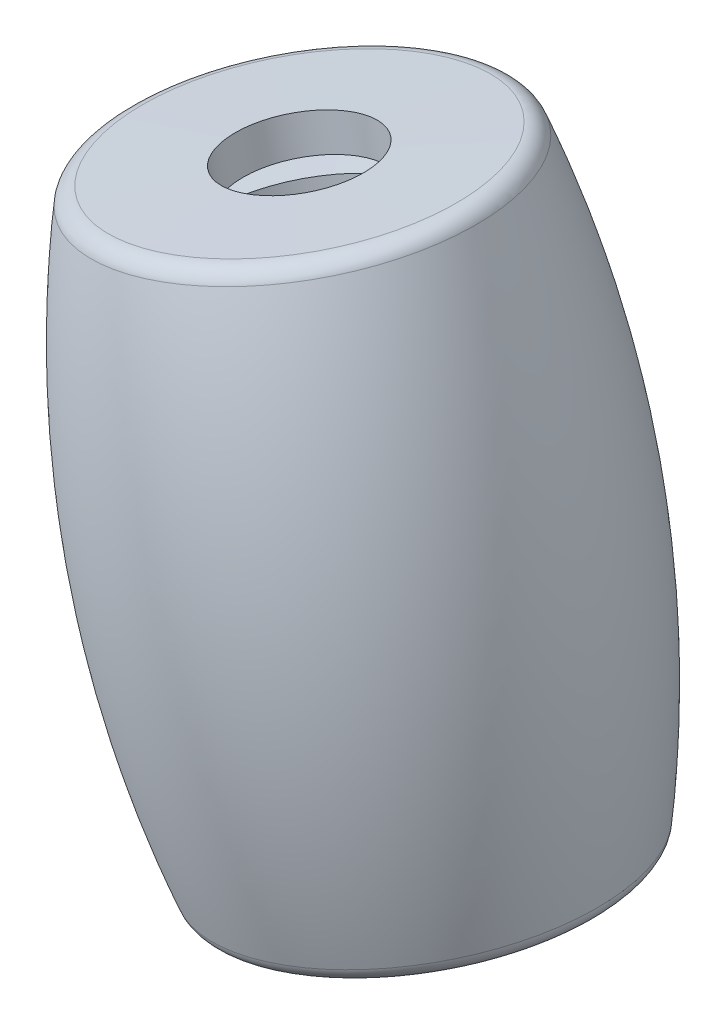
ISO-10303-21;
HEADER;
FILE_DESCRIPTION(('STEP AP214'),'2;1');
FILE_NAME('part.step','',(''),(''),'','','');
FILE_SCHEMA(('AUTOMOTIVE_DESIGN { 1 0 10303 214 1 1 1 1 }'));
ENDSEC;
DATA;
#1=APPLICATION_CONTEXT('core data for automotive mechanical design processes');
#2=APPLICATION_PROTOCOL_DEFINITION('international standard','automotive_design',2000,#1);
#3=PRODUCT_CONTEXT('',#1,'mechanical');
#4=PRODUCT('Part','Part','',(#3));
#5=PRODUCT_RELATED_PRODUCT_CATEGORY('part','',(#4));
#6=PRODUCT_DEFINITION_FORMATION('','',#4);
#7=PRODUCT_DEFINITION_CONTEXT('part definition',#1,'design');
#8=PRODUCT_DEFINITION('design','',#6,#7);
#9=PRODUCT_DEFINITION_SHAPE('','',#8);
#10=(LENGTH_UNIT() NAMED_UNIT(*) SI_UNIT(.MILLI.,.METRE.));
#11=(NAMED_UNIT(*) PLANE_ANGLE_UNIT() SI_UNIT($,.RADIAN.));
#12=(NAMED_UNIT(*) SI_UNIT($,.STERADIAN.) SOLID_ANGLE_UNIT());
#13=UNCERTAINTY_MEASURE_WITH_UNIT(LENGTH_MEASURE(1.E-05),#10,'distance_accuracy_value','');
#14=(GEOMETRIC_REPRESENTATION_CONTEXT(3) GLOBAL_UNCERTAINTY_ASSIGNED_CONTEXT((#13)) GLOBAL_UNIT_ASSIGNED_CONTEXT((#10,
#11,#12)) REPRESENTATION_CONTEXT('',''));
#15=CARTESIAN_POINT('',(0.,0.,0.));
#16=DIRECTION('',(0.,0.,1.));
#17=DIRECTION('',(1.,0.,0.));
#18=AXIS2_PLACEMENT_3D('',#15,#16,#17);
#19=CARTESIAN_POINT('',(-23.5095303593415,-4.85303845886221,0.));
#20=DIRECTION('',(0.222520933956314,-0.974927912181824,0.));
#21=DIRECTION('',(0.974927912181824,0.222520933956314,0.));
#22=AXIS2_PLACEMENT_3D('',#19,#20,#21);
#23=CONICAL_SURFACE('',#22,4.5000000000979,1.48352986419963);
#24=CARTESIAN_POINT('',(-23.5095303593419,-4.85303845886064,0.));
#25=DIRECTION('',(-0.222520933956314,0.974927912181824,0.));
#26=DIRECTION('',(-0.974927912181824,-0.222520933956314,0.));
#27=AXIS2_PLACEMENT_3D('',#24,#25,#26);
#28=CIRCLE('',#27,4.5);
#29=CARTESIAN_POINT('',(-27.8967059641601,-5.85438266166405,0.));
#30=VERTEX_POINT('',#29);
#31=EDGE_CURVE('E19',#30,#30,#28,.F.);
#32=ORIENTED_EDGE('',*,*,#31,.T.);
#33=EDGE_LOOP('',(#32));
#34=FACE_BOUND('',#33,.T.);
#35=CARTESIAN_POINT('',(-23.5387324480194,-4.72509574875428,0.));
#36=DIRECTION('',(-0.222520933956314,0.974927912181824,0.));
#37=DIRECTION('',(-0.974927912181824,-0.222520933956314,0.));
#38=AXIS2_PLACEMENT_3D('',#35,#36,#37);
#39=CIRCLE('',#38,3.);
#40=CARTESIAN_POINT('',(-26.4635161845649,-5.39265855062322,0.));
#41=VERTEX_POINT('',#40);
#42=EDGE_CURVE('E91',#41,#41,#39,.T.);
#43=ORIENTED_EDGE('',*,*,#42,.T.);
#44=EDGE_LOOP('',(#43));
#45=FACE_BOUND('',#44,.T.);
#46=ADVANCED_FACE('F15',(#34,#45),#23,.F.);
#47=CARTESIAN_POINT('',(-23.3982698923637,-5.34050241495155,0.));
#48=DIRECTION('',(-0.222520933956314,0.974927912181824,0.));
#49=DIRECTION('',(-0.974927912181824,-0.222520933956314,0.));
#50=AXIS2_PLACEMENT_3D('',#47,#48,#49);
#51=CYLINDRICAL_SURFACE('',#50,4.5);
#52=CARTESIAN_POINT('',(-23.2870094253839,-5.82796637104959,0.));
#53=DIRECTION('',(-0.222520933956314,0.974927912181824,0.));
#54=DIRECTION('',(0.0263565158210007,0.00601570274380409,0.999634505904171));
#55=AXIS2_PLACEMENT_3D('',#52,#53,#54);
#56=CIRCLE('',#55,4.49999999998419);
#57=CARTESIAN_POINT('',(-23.1684051041898,-5.80089570870257,4.49835527655296));
#58=VERTEX_POINT('',#57);
#59=EDGE_CURVE('E89',#58,#58,#56,.F.);
#60=ORIENTED_EDGE('',*,*,#59,.T.);
#61=EDGE_LOOP('',(#60));
#62=FACE_BOUND('',#61,.T.);
#63=ORIENTED_EDGE('',*,*,#31,.F.);
#64=EDGE_LOOP('',(#63));
#65=FACE_BOUND('',#64,.T.);
#66=ADVANCED_FACE('F99',(#62,#65),#51,.F.);
#67=CARTESIAN_POINT('',(-23.8544378069741,-3.34190019497881,0.));
#68=DIRECTION('',(-0.222520933956314,0.974927912181824,0.));
#69=DIRECTION('',(-0.974927912181824,-0.222520933956314,0.));
#70=AXIS2_PLACEMENT_3D('',#67,#68,#69);
#71=CYLINDRICAL_SURFACE('',#70,3.);
#72=ORIENTED_EDGE('',*,*,#42,.F.);
#73=EDGE_LOOP('',(#72));
#74=FACE_BOUND('',#73,.T.);
#75=CARTESIAN_POINT('',(-24.1701431659294,-1.95870464120101,0.));
#76=DIRECTION('',(-0.222520933956314,0.974927912181824,0.));
#77=DIRECTION('',(0.0263565158208105,0.00601570274376067,0.999634505904176));
#78=AXIS2_PLACEMENT_3D('',#75,#76,#77);
#79=CIRCLE('',#78,3.0000000000084);
#80=CARTESIAN_POINT('',(-24.0910736184667,-1.94065753296968,2.99890351772092));
#81=VERTEX_POINT('',#80);
#82=EDGE_CURVE('E86',#81,#81,#79,.T.);
#83=ORIENTED_EDGE('',*,*,#82,.T.);
#84=EDGE_LOOP('',(#83));
#85=FACE_BOUND('',#84,.T.);
#86=ADVANCED_FACE('F101',(#74,#85),#71,.F.);
#87=CARTESIAN_POINT('',(-23.2870094253839,-5.82796637104959,0.));
#88=DIRECTION('',(-0.222520933956314,0.974927912181824,0.));
#89=DIRECTION('',(-0.974927912181824,-0.222520933956314,0.));
#90=AXIS2_PLACEMENT_3D('',#87,#88,#89);
#91=CONICAL_SURFACE('',#90,4.49999999998419,1.48352986420208);
#92=ORIENTED_EDGE('',*,*,#59,.F.);
#93=EDGE_LOOP('',(#92));
#94=FACE_BOUND('',#93,.T.);
#95=CARTESIAN_POINT('',(-23.257807336708,-5.95590908114882,0.));
#96=DIRECTION('',(-0.222520933956314,0.974927912181824,0.));
#97=DIRECTION('',(-0.974927912181824,-0.222520933956314,0.));
#98=AXIS2_PLACEMENT_3D('',#95,#96,#97);
#99=CIRCLE('',#98,3.);
#100=CARTESIAN_POINT('',(-26.1825910732534,-6.62347188301776,0.));
#101=VERTEX_POINT('',#100);
#102=EDGE_CURVE('E83',#101,#101,#99,.F.);
#103=ORIENTED_EDGE('',*,*,#102,.T.);
#104=EDGE_LOOP('',(#103));
#105=FACE_BOUND('',#104,.T.);
#106=ADVANCED_FACE('F109',(#94,#105),#91,.F.);
#107=CARTESIAN_POINT('',(-24.1993452546054,-1.83076193110155,0.));
#108=DIRECTION('',(-0.222520933956314,0.974927912181824,0.));
#109=DIRECTION('',(-0.974927912181824,-0.222520933956314,0.));
#110=AXIS2_PLACEMENT_3D('',#107,#108,#109);
#111=CONICAL_SURFACE('',#110,4.49999999998414,1.48352986419936);
#112=CARTESIAN_POINT('',(-24.1993452546064,-1.83076193109698,0.));
#113=DIRECTION('',(-0.222520933956314,0.974927912181824,0.));
#114=DIRECTION('',(-0.974927912181824,-0.222520933956314,0.));
#115=AXIS2_PLACEMENT_3D('',#112,#113,#114);
#116=CIRCLE('',#115,4.5);
#117=CARTESIAN_POINT('',(-28.5865208594246,-2.8321061339004,0.));
#118=VERTEX_POINT('',#117);
#119=EDGE_CURVE('E80',#118,#118,#116,.T.);
#120=ORIENTED_EDGE('',*,*,#119,.T.);
#121=EDGE_LOOP('',(#120));
#122=FACE_BOUND('',#121,.T.);
#123=ORIENTED_EDGE('',*,*,#82,.F.);
#124=EDGE_LOOP('',(#123));
#125=FACE_BOUND('',#124,.T.);
#126=ADVANCED_FACE('F186',(#122,#125),#111,.F.);
#127=CARTESIAN_POINT('',(-22.9421019777533,-7.33910463492429,0.));
#128=DIRECTION('',(-0.222520933956314,0.974927912181824,0.));
#129=DIRECTION('',(-0.974927912181824,-0.222520933956314,0.));
#130=AXIS2_PLACEMENT_3D('',#127,#128,#129);
#131=CYLINDRICAL_SURFACE('',#130,3.);
#132=ORIENTED_EDGE('',*,*,#102,.F.);
#133=EDGE_LOOP('',(#132));
#134=FACE_BOUND('',#133,.T.);
#135=CARTESIAN_POINT('',(-22.6263966187975,-8.72230018870423,0.));
#136=DIRECTION('',(0.222520933956314,-0.974927912181824,0.));
#137=DIRECTION('',(-0.0263565158209064,-0.00601570274378249,-0.999634505904173));
#138=AXIS2_PLACEMENT_3D('',#135,#136,#137);
#139=CIRCLE('',#138,3.0000000000084);
#140=CARTESIAN_POINT('',(-22.7054661662605,-8.74034729693562,-2.99890351772092));
#141=VERTEX_POINT('',#140);
#142=EDGE_CURVE('E77',#141,#141,#139,.T.);
#143=ORIENTED_EDGE('',*,*,#142,.T.);
#144=EDGE_LOOP('',(#143));
#145=FACE_BOUND('',#144,.T.);
#146=ADVANCED_FACE('F182',(#134,#145),#131,.F.);
#147=CARTESIAN_POINT('',(-24.3106057215846,-1.34329797500607,0.));
#148=DIRECTION('',(-0.222520933956314,0.974927912181824,0.));
#149=DIRECTION('',(-0.974927912181824,-0.222520933956314,0.));
#150=AXIS2_PLACEMENT_3D('',#147,#148,#149);
#151=CYLINDRICAL_SURFACE('',#150,4.5);
#152=CARTESIAN_POINT('',(-24.4218661885643,-0.855834018908472,0.));
#153=DIRECTION('',(0.222520933956314,-0.974927912181824,0.));
#154=DIRECTION('',(-0.0263565158205878,-0.00601570274370977,-0.999634505904182));
#155=AXIS2_PLACEMENT_3D('',#152,#153,#154);
#156=CIRCLE('',#155,4.49999999998413);
#157=CARTESIAN_POINT('',(-24.5404705097565,-0.88290468125507,-4.49835527655296));
#158=VERTEX_POINT('',#157);
#159=EDGE_CURVE('E74',#158,#158,#156,.F.);
#160=ORIENTED_EDGE('',*,*,#159,.T.);
#161=EDGE_LOOP('',(#160));
#162=FACE_BOUND('',#161,.T.);
#163=ORIENTED_EDGE('',*,*,#119,.F.);
#164=EDGE_LOOP('',(#163));
#165=FACE_BOUND('',#164,.T.);
#166=ADVANCED_FACE('F178',(#162,#165),#151,.F.);
#167=CARTESIAN_POINT('',(-22.59719453012,-8.85024289881044,0.));
#168=DIRECTION('',(0.222520933956314,-0.974927912181824,0.));
#169=DIRECTION('',(0.974927912181824,0.222520933956314,0.));
#170=AXIS2_PLACEMENT_3D('',#167,#168,#169);
#171=CONICAL_SURFACE('',#170,4.49999999998419,1.48352986419684);
#172=ORIENTED_EDGE('',*,*,#142,.F.);
#173=EDGE_LOOP('',(#172));
#174=FACE_BOUND('',#173,.T.);
#175=CARTESIAN_POINT('',(-22.597194530121,-8.85024289880612,0.));
#176=DIRECTION('',(-0.222520933956314,0.974927912181824,0.));
#177=DIRECTION('',(-0.974927912181824,-0.222520933956314,0.));
#178=AXIS2_PLACEMENT_3D('',#175,#176,#177);
#179=CIRCLE('',#178,4.5);
#180=CARTESIAN_POINT('',(-26.9843701349392,-9.85158710160953,0.));
#181=VERTEX_POINT('',#180);
#182=EDGE_CURVE('E71',#181,#181,#179,.F.);
#183=ORIENTED_EDGE('',*,*,#182,.T.);
#184=EDGE_LOOP('',(#183));
#185=FACE_BOUND('',#184,.T.);
#186=ADVANCED_FACE('F174',(#174,#185),#171,.F.);
#187=CARTESIAN_POINT('',(-24.4218661885642,-0.855834018908567,0.));
#188=DIRECTION('',(0.222520933956314,-0.974927912181824,0.));
#189=DIRECTION('',(0.974927912181824,0.222520933956314,0.));
#190=AXIS2_PLACEMENT_3D('',#187,#188,#189);
#191=CONICAL_SURFACE('',#190,4.49999999992729,1.48352986419471);
#192=ORIENTED_EDGE('',*,*,#159,.F.);
#193=EDGE_LOOP('',(#192));
#194=FACE_BOUND('',#193,.T.);
#195=CARTESIAN_POINT('',(-24.4510682772403,-0.727891308808807,0.));
#196=DIRECTION('',(-0.222520933956314,0.974927912181824,0.));
#197=DIRECTION('',(-0.974927912181824,-0.222520933956314,0.));
#198=AXIS2_PLACEMENT_3D('',#195,#196,#197);
#199=CIRCLE('',#198,3.);
#200=CARTESIAN_POINT('',(-27.3758520137858,-1.39545411067775,0.));
#201=VERTEX_POINT('',#200);
#202=EDGE_CURVE('E68',#201,#201,#199,.T.);
#203=ORIENTED_EDGE('',*,*,#202,.T.);
#204=EDGE_LOOP('',(#203));
#205=FACE_BOUND('',#204,.T.);
#206=ADVANCED_FACE('F170',(#194,#205),#191,.F.);
#207=CARTESIAN_POINT('',(-22.4859340631428,-9.33770685489703,0.));
#208=DIRECTION('',(-0.222520933956314,0.974927912181824,0.));
#209=DIRECTION('',(-0.974927912181824,-0.222520933956314,0.));
#210=AXIS2_PLACEMENT_3D('',#207,#208,#209);
#211=CYLINDRICAL_SURFACE('',#210,4.5);
#212=CARTESIAN_POINT('',(-22.3746735961657,-9.82517081098326,0.));
#213=DIRECTION('',(-0.222520933956314,0.974927912181824,0.));
#214=DIRECTION('',(0.026356515821208,0.00601570274385147,0.999634505904165));
#215=AXIS2_PLACEMENT_3D('',#212,#213,#214);
#216=CIRCLE('',#215,4.49999999998421);
#217=CARTESIAN_POINT('',(-22.2560692749707,-9.79810014863602,4.49835527655296));
#218=VERTEX_POINT('',#217);
#219=EDGE_CURVE('E65',#218,#218,#216,.F.);
#220=ORIENTED_EDGE('',*,*,#219,.T.);
#221=EDGE_LOOP('',(#220));
#222=FACE_BOUND('',#221,.T.);
#223=ORIENTED_EDGE('',*,*,#182,.F.);
#224=EDGE_LOOP('',(#223));
#225=FACE_BOUND('',#224,.T.);
#226=ADVANCED_FACE('F166',(#222,#225),#211,.F.);
#227=CARTESIAN_POINT('',(-24.6117730782902,-0.0237975708421165,0.));
#228=DIRECTION('',(-0.222520933956314,0.974927912181824,0.));
#229=DIRECTION('',(-0.974927912181824,-0.222520933956314,0.));
#230=AXIS2_PLACEMENT_3D('',#227,#228,#229);
#231=CYLINDRICAL_SURFACE('',#230,3.);
#232=ORIENTED_EDGE('',*,*,#202,.F.);
#233=EDGE_LOOP('',(#232));
#234=FACE_BOUND('',#233,.T.);
#235=CARTESIAN_POINT('',(-24.7724778793394,0.68029616712169,0.));
#236=DIRECTION('',(-0.222520933956314,0.974927912181824,0.));
#237=DIRECTION('',(0.0263565158206279,0.00601570274371903,0.999634505904181));
#238=AXIS2_PLACEMENT_3D('',#235,#236,#237);
#239=CIRCLE('',#238,3.00000000000838);
#240=CARTESIAN_POINT('',(-24.6934083318773,0.698343275352897,2.99890351772092));
#241=VERTEX_POINT('',#240);
#242=EDGE_CURVE('E62',#241,#241,#239,.T.);
#243=ORIENTED_EDGE('',*,*,#242,.T.);
#244=EDGE_LOOP('',(#243));
#245=FACE_BOUND('',#244,.T.);
#246=ADVANCED_FACE('F162',(#234,#245),#231,.F.);
#247=CARTESIAN_POINT('',(-22.3746735961657,-9.82517081098326,0.));
#248=DIRECTION('',(-0.222520933956314,0.974927912181824,0.));
#249=DIRECTION('',(-0.974927912181824,-0.222520933956314,0.));
#250=AXIS2_PLACEMENT_3D('',#247,#248,#249);
#251=CONICAL_SURFACE('',#250,4.49999999998421,1.48352986419478);
#252=ORIENTED_EDGE('',*,*,#219,.F.);
#253=EDGE_LOOP('',(#252));
#254=FACE_BOUND('',#253,.T.);
#255=CARTESIAN_POINT('',(-22.3454715074871,-9.9531135210943,0.));
#256=DIRECTION('',(-0.222520933956314,0.974927912181824,0.));
#257=DIRECTION('',(-0.974927912181824,-0.222520933956314,0.));
#258=AXIS2_PLACEMENT_3D('',#255,#256,#257);
#259=CIRCLE('',#258,3.);
#260=CARTESIAN_POINT('',(-25.2702552440326,-10.6206763229632,0.));
#261=VERTEX_POINT('',#260);
#262=EDGE_CURVE('E59',#261,#261,#259,.F.);
#263=ORIENTED_EDGE('',*,*,#262,.T.);
#264=EDGE_LOOP('',(#263));
#265=FACE_BOUND('',#264,.T.);
#266=ADVANCED_FACE('F158',(#254,#265),#251,.F.);
#267=CARTESIAN_POINT('',(-24.7890257295888,0.752797036176678,0.));
#268=DIRECTION('',(-0.222520933956314,0.974927912181824,0.));
#269=DIRECTION('',(-0.974927912181824,-0.222520933956314,0.));
#270=AXIS2_PLACEMENT_3D('',#267,#268,#269);
#271=CONICAL_SURFACE('',#270,3.84999999997193,1.48352986419926);
#272=CARTESIAN_POINT('',(-24.7890257295907,0.752797036184849,0.));
#273=DIRECTION('',(-0.222520933956314,0.974927912181824,0.));
#274=DIRECTION('',(-0.974927912181824,-0.222520933956314,0.));
#275=AXIS2_PLACEMENT_3D('',#272,#273,#274);
#276=CIRCLE('',#275,3.85);
#277=CARTESIAN_POINT('',(-28.5424981914907,-0.10390855954696,0.));
#278=VERTEX_POINT('',#277);
#279=EDGE_CURVE('E56',#278,#278,#276,.T.);
#280=ORIENTED_EDGE('',*,*,#279,.T.);
#281=EDGE_LOOP('',(#280));
#282=FACE_BOUND('',#281,.T.);
#283=ORIENTED_EDGE('',*,*,#242,.F.);
#284=EDGE_LOOP('',(#283));
#285=FACE_BOUND('',#284,.T.);
#286=ADVANCED_FACE('F154',(#282,#285),#271,.F.);
#287=CARTESIAN_POINT('',(-22.1847667064372,-10.657207259061,0.));
#288=DIRECTION('',(-0.222520933956314,0.974927912181824,0.));
#289=DIRECTION('',(-0.974927912181824,-0.222520933956314,0.));
#290=AXIS2_PLACEMENT_3D('',#287,#288,#289);
#291=CYLINDRICAL_SURFACE('',#290,3.);
#292=ORIENTED_EDGE('',*,*,#262,.F.);
#293=EDGE_LOOP('',(#292));
#294=FACE_BOUND('',#293,.T.);
#295=CARTESIAN_POINT('',(-22.0240619053874,-11.3613009970273,0.));
#296=DIRECTION('',(0.222520933956314,-0.974927912181824,0.));
#297=DIRECTION('',(-0.0263565158206591,-0.00601570274372598,-0.99963450590418));
#298=AXIS2_PLACEMENT_3D('',#295,#296,#297);
#299=CIRCLE('',#298,2.99999999995151);
#300=CARTESIAN_POINT('',(-22.1031314528481,-11.3793481052582,-2.99890351766408));
#301=VERTEX_POINT('',#300);
#302=EDGE_CURVE('E53',#301,#301,#299,.T.);
#303=ORIENTED_EDGE('',*,*,#302,.T.);
#304=EDGE_LOOP('',(#303));
#305=FACE_BOUND('',#304,.T.);
#306=ADVANCED_FACE('F150',(#294,#305),#291,.F.);
#307=CARTESIAN_POINT('',(-24.8922472369865,1.20504000905242,0.));
#308=DIRECTION('',(-0.222520933956314,0.974927912181824,0.));
#309=DIRECTION('',(-0.974927912181824,-0.222520933956314,0.));
#310=AXIS2_PLACEMENT_3D('',#307,#308,#309);
#311=CYLINDRICAL_SURFACE('',#310,3.85);
#312=CARTESIAN_POINT('',(-24.9954687443835,1.65728298192504,0.));
#313=DIRECTION('',(0.222520933956314,-0.974927912181824,0.));
#314=DIRECTION('',(-0.0263565158209235,-0.00601570274378623,-0.999634505904173));
#315=AXIS2_PLACEMENT_3D('',#312,#313,#314);
#316=CIRCLE('',#315,3.84999999997193);
#317=CARTESIAN_POINT('',(-25.0969413302933,1.63412252636164,-3.848592847703));
#318=VERTEX_POINT('',#317);
#319=EDGE_CURVE('E50',#318,#318,#316,.F.);
#320=ORIENTED_EDGE('',*,*,#319,.T.);
#321=EDGE_LOOP('',(#320));
#322=FACE_BOUND('',#321,.T.);
#323=ORIENTED_EDGE('',*,*,#279,.F.);
#324=EDGE_LOOP('',(#323));
#325=FACE_BOUND('',#324,.T.);
#326=ADVANCED_FACE('F146',(#322,#325),#311,.F.);
#327=CARTESIAN_POINT('',(-22.0075140551396,-11.4338018660756,0.));
#328=DIRECTION('',(0.222520933956314,-0.974927912181824,0.));
#329=DIRECTION('',(0.974927912181824,0.222520933956314,0.));
#330=AXIS2_PLACEMENT_3D('',#327,#328,#329);
#331=CONICAL_SURFACE('',#330,3.84999999985819,1.48352986419926);
#332=CARTESIAN_POINT('',(-22.0075140551367,-11.4338018660879,0.));
#333=DIRECTION('',(-0.222520933956314,0.974927912181824,0.));
#334=DIRECTION('',(-0.974927912181824,-0.222520933956314,0.));
#335=AXIS2_PLACEMENT_3D('',#332,#333,#334);
#336=CIRCLE('',#335,3.85000000000001);
#337=CARTESIAN_POINT('',(-25.7609865170368,-12.2905074618198,0.));
#338=VERTEX_POINT('',#337);
#339=EDGE_CURVE('E47',#338,#338,#336,.F.);
#340=ORIENTED_EDGE('',*,*,#339,.T.);
#341=EDGE_LOOP('',(#340));
#342=FACE_BOUND('',#341,.T.);
#343=ORIENTED_EDGE('',*,*,#302,.F.);
#344=EDGE_LOOP('',(#343));
#345=FACE_BOUND('',#344,.T.);
#346=ADVANCED_FACE('F142',(#342,#345),#331,.F.);
#347=CARTESIAN_POINT('',(-24.9954687443836,1.65728298192543,0.));
#348=DIRECTION('',(0.222520933956314,-0.974927912181824,0.));
#349=DIRECTION('',(0.974927912181824,0.222520933956314,0.));
#350=AXIS2_PLACEMENT_3D('',#347,#348,#349);
#351=CONICAL_SURFACE('',#350,3.85000000002879,1.56206968054022);
#352=ORIENTED_EDGE('',*,*,#319,.F.);
#353=EDGE_LOOP('',(#352));
#354=FACE_BOUND('',#353,.T.);
#355=CARTESIAN_POINT('',(-24.9993525659249,1.67429911591027,0.));
#356=DIRECTION('',(-0.222520933956314,0.974927912181824,0.));
#357=DIRECTION('',(-0.974927912181824,-0.222520933956314,0.));
#358=AXIS2_PLACEMENT_3D('',#355,#356,#357);
#359=CIRCLE('',#358,1.85);
#360=CARTESIAN_POINT('',(-26.8029692034613,1.26263538809108,0.));
#361=VERTEX_POINT('',#360);
#362=EDGE_CURVE('E44',#361,#361,#359,.T.);
#363=ORIENTED_EDGE('',*,*,#362,.T.);
#364=EDGE_LOOP('',(#363));
#365=FACE_BOUND('',#364,.T.);
#366=ADVANCED_FACE('F138',(#354,#365),#351,.F.);
#367=CARTESIAN_POINT('',(-21.8239342846228,-12.238117393638,0.));
#368=DIRECTION('',(-0.222520933956314,0.974927912181824,0.));
#369=DIRECTION('',(-0.974927912181824,-0.222520933956314,0.));
#370=AXIS2_PLACEMENT_3D('',#367,#368,#369);
#371=CYLINDRICAL_SURFACE('',#370,3.85000000000001);
#372=ORIENTED_EDGE('',*,*,#339,.F.);
#373=EDGE_LOOP('',(#372));
#374=FACE_BOUND('',#373,.T.);
#375=CARTESIAN_POINT('',(-21.6403545141094,-13.0424329211854,0.));
#376=DIRECTION('',(-0.222520933956314,0.974927912181824,0.));
#377=DIRECTION('',(0.0263565158205047,0.00601570274369066,0.999634505904184));
#378=AXIS2_PLACEMENT_3D('',#375,#376,#377);
#379=CIRCLE('',#378,3.84999999997189);
#380=CARTESIAN_POINT('',(-21.5388819282012,-13.0192724656224,3.848592847703));
#381=VERTEX_POINT('',#380);
#382=EDGE_CURVE('E41',#381,#381,#379,.T.);
#383=ORIENTED_EDGE('',*,*,#382,.F.);
#384=EDGE_LOOP('',(#383));
#385=FACE_BOUND('',#384,.T.);
#386=ADVANCED_FACE('F134',(#374,#385),#371,.F.);
#387=CARTESIAN_POINT('',(-25.1106130329031,2.16176307200118,0.));
#388=DIRECTION('',(-0.222520933956314,0.974927912181824,0.));
#389=DIRECTION('',(-0.974927912181824,-0.222520933956314,0.));
#390=AXIS2_PLACEMENT_3D('',#387,#388,#389);
#391=CYLINDRICAL_SURFACE('',#390,1.85);
#392=ORIENTED_EDGE('',*,*,#362,.F.);
#393=EDGE_LOOP('',(#392));
#394=FACE_BOUND('',#393,.T.);
#395=CARTESIAN_POINT('',(-25.2218734998796,2.64922702808501,0.));
#396=DIRECTION('',(0.222520933956314,-0.974927912181824,0.));
#397=DIRECTION('',(-0.0263565158209801,-0.00601570274379938,-0.999634505904171));
#398=AXIS2_PLACEMENT_3D('',#395,#396,#397);
#399=CIRCLE('',#398,1.85000000000424);
#400=CARTESIAN_POINT('',(-25.2706330541486,2.63809797800896,-1.84932383592695));
#401=VERTEX_POINT('',#400);
#402=EDGE_CURVE('E38',#401,#401,#399,.T.);
#403=ORIENTED_EDGE('',*,*,#402,.F.);
#404=EDGE_LOOP('',(#403));
#405=FACE_BOUND('',#404,.T.);
#406=ADVANCED_FACE('F130',(#394,#405),#391,.F.);
#407=CARTESIAN_POINT('',(-21.6416679369421,-13.0366784397652,0.));
#408=DIRECTION('',(-0.222520933956314,0.974927912181824,0.));
#409=DIRECTION('',(-0.974927912181824,-0.222520933956314,0.));
#410=AXIS2_PLACEMENT_3D('',#407,#408,#409);
#411=CONICAL_SURFACE('',#410,4.52635591340722,1.5620696805407);
#412=CARTESIAN_POINT('',(-21.6416679369423,-13.0366784397641,0.));
#413=DIRECTION('',(-0.222520933956314,0.974927912181824,0.));
#414=DIRECTION('',(0.0263565158207468,0.00601570274374602,0.999634505904178));
#415=AXIS2_PLACEMENT_3D('',#412,#413,#414);
#416=CIRCLE('',#415,4.52635591341317);
#417=CARTESIAN_POINT('',(-21.5223689657001,-13.0094492280766,4.52470155705122));
#418=VERTEX_POINT('',#417);
#419=EDGE_CURVE('E35',#418,#418,#416,.T.);
#420=ORIENTED_EDGE('',*,*,#419,.F.);
#421=EDGE_LOOP('',(#420));
#422=FACE_BOUND('',#421,.T.);
#423=ORIENTED_EDGE('',*,*,#382,.T.);
#424=EDGE_LOOP('',(#423));
#425=FACE_BOUND('',#424,.T.);
#426=ADVANCED_FACE('F126',(#422,#425),#411,.T.);
#427=CARTESIAN_POINT('',(-25.2166762555059,2.62645641268116,0.));
#428=DIRECTION('',(0.222520933956314,-0.974927912181824,0.));
#429=DIRECTION('',(0.974927912181824,0.222520933956314,0.));
#430=AXIS2_PLACEMENT_3D('',#427,#428,#429);
#431=CONICAL_SURFACE('',#430,4.5263559138053,1.56206968054048);
#432=CARTESIAN_POINT('',(-25.216676255504,2.62645641267324,0.));
#433=DIRECTION('',(0.222520933956314,-0.974927912181824,0.));
#434=DIRECTION('',(0.0263565158207467,0.00601570274374621,0.999634505904178));
#435=AXIS2_PLACEMENT_3D('',#432,#433,#434);
#436=CIRCLE('',#435,4.52635591396777);
#437=CARTESIAN_POINT('',(-25.0973772842472,2.65368562436406,4.52470155760562));
#438=VERTEX_POINT('',#437);
#439=EDGE_CURVE('E28',#438,#438,#436,.T.);
#440=ORIENTED_EDGE('',*,*,#439,.F.);
#441=EDGE_LOOP('',(#440));
#442=FACE_BOUND('',#441,.T.);
#443=ORIENTED_EDGE('',*,*,#402,.T.);
#444=EDGE_LOOP('',(#443));
#445=FACE_BOUND('',#444,.T.);
#446=ADVANCED_FACE('F123',(#442,#445),#431,.T.);
#447=CARTESIAN_POINT('',(-21.7529241674625,-12.5492330448082,0.));
#448=DIRECTION('',(-0.222520933956314,0.974927912181824,0.));
#449=DIRECTION('',(-0.974927912181824,-0.222520933956314,0.));
#450=AXIS2_PLACEMENT_3D('',#447,#448,#449);
#451=TOROIDAL_SURFACE('',#450,4.521992645522,0.500000000000003);
#452=CARTESIAN_POINT('',(-21.7245131856191,-12.6737096894059,0.));
#453=DIRECTION('',(-0.222520933956314,0.974927912181824,0.));
#454=DIRECTION('',(0.0263565158207465,0.00601570274374641,0.999634505904178));
#455=AXIS2_PLACEMENT_3D('',#452,#453,#454);
#456=CIRCLE('',#455,5.0054162496834);
#457=CARTESIAN_POINT('',(-21.5925878530449,-12.6435985931391,5.00358679959702));
#458=VERTEX_POINT('',#457);
#459=EDGE_CURVE('E23',#458,#458,#456,.T.);
#460=ORIENTED_EDGE('',*,*,#459,.F.);
#461=EDGE_LOOP('',(#460));
#462=FACE_BOUND('',#461,.T.);
#463=ORIENTED_EDGE('',*,*,#419,.T.);
#464=EDGE_LOOP('',(#463));
#465=FACE_BOUND('',#464,.T.);
#466=ADVANCED_FACE('F119',(#462,#465),#451,.T.);
#467=CARTESIAN_POINT('',(-25.1054200249849,2.13901101772202,0.));
#468=DIRECTION('',(-0.222520933956314,0.974927912181824,0.));
#469=DIRECTION('',(-0.974927912181824,-0.222520933956314,0.));
#470=AXIS2_PLACEMENT_3D('',#467,#468,#469);
#471=TOROIDAL_SURFACE('',#470,4.521992645522,0.500000000000002);
#472=ORIENTED_EDGE('',*,*,#439,.T.);
#473=EDGE_LOOP('',(#472));
#474=FACE_BOUND('',#473,.T.);
#475=CARTESIAN_POINT('',(-25.1338310068283,2.26348766231974,0.));
#476=DIRECTION('',(-0.222520933956314,0.974927912181824,0.));
#477=DIRECTION('',(0.0263565158207465,0.00601570274374606,0.999634505904178));
#478=AXIS2_PLACEMENT_3D('',#475,#476,#477);
#479=CIRCLE('',#478,5.0054162496834);
#480=CARTESIAN_POINT('',(-25.0019056742541,2.29359875858655,5.00358679959702));
#481=VERTEX_POINT('',#480);
#482=EDGE_CURVE('E10',#481,#481,#479,.F.);
#483=ORIENTED_EDGE('',*,*,#482,.F.);
#484=EDGE_LOOP('',(#483));
#485=FACE_BOUND('',#484,.T.);
#486=ADVANCED_FACE('F17',(#474,#485),#471,.T.);
#487=CARTESIAN_POINT('',(-24.0617284759216,-5.34948787939297,-23.9912281417004));
#488=DIRECTION('',(0.974571581786069,0.222439603868756,-0.0270343227344496));
#489=DIRECTION('',(0.0263565158207466,0.00601570274374605,0.999634505904178));
#490=AXIS2_PLACEMENT_3D('',#487,#488,#489);
#491=CIRCLE('',#490,30.0000000000002);
#492=TRIMMED_CURVE('',#491,(PARAMETER_VALUE(-0.643501108793283)),
(PARAMETER_VALUE(0.643501108793283)),.T.,.PARAMETER.);
#493=CARTESIAN_POINT('',(-23.4291720962237,-5.20511101354306,0.));
#494=DIRECTION('',(-0.222520933956314,0.974927912181824,0.));
#495=AXIS1_PLACEMENT('',#493,#494);
#496=SURFACE_OF_REVOLUTION('',#492,#495);
#497=ORIENTED_EDGE('',*,*,#482,.T.);
#498=EDGE_LOOP('',(#497));
#499=FACE_BOUND('',#498,.T.);
#500=ORIENTED_EDGE('',*,*,#459,.T.);
#501=EDGE_LOOP('',(#500));
#502=FACE_BOUND('',#501,.T.);
#503=ADVANCED_FACE('F113',(#499,#502),#496,.F.);
#504=CLOSED_SHELL('',(#46,#66,#86,#106,#126,#146,#166,#186,#206,#226,#246,#266,#286,#306,#326,
#346,#366,#386,#406,#426,#446,#466,#486,#503));
#505=MANIFOLD_SOLID_BREP('B1',#504);
#506=ADVANCED_BREP_SHAPE_REPRESENTATION('',(#18,#505),#14);
#507=SHAPE_DEFINITION_REPRESENTATION(#9,#506);
ENDSEC;
END-ISO-10303-21;
